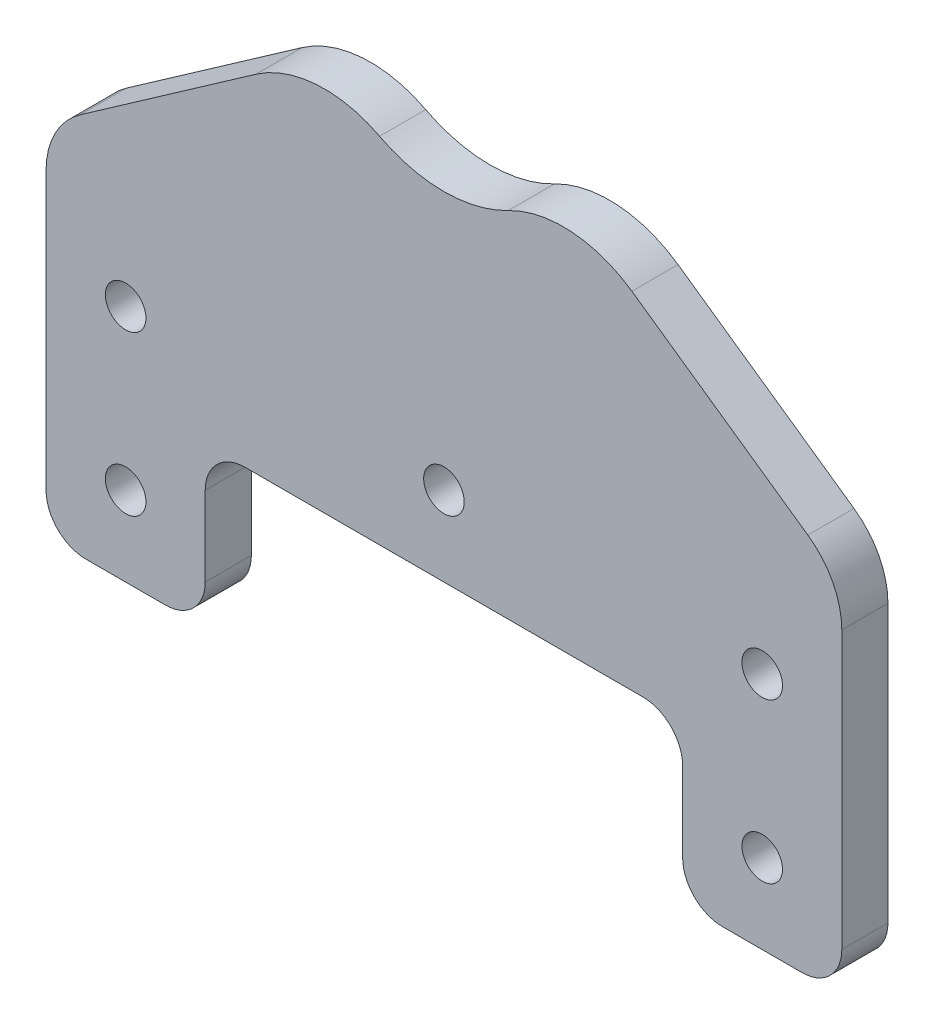
ISO-10303-21;
HEADER;
FILE_DESCRIPTION(('STEP AP214'),'2;1');
FILE_NAME('part.step','',(''),(''),'','','');
FILE_SCHEMA(('AUTOMOTIVE_DESIGN { 1 0 10303 214 1 1 1 1 }'));
ENDSEC;
DATA;
#1=APPLICATION_CONTEXT('core data for automotive mechanical design processes');
#2=APPLICATION_PROTOCOL_DEFINITION('international standard','automotive_design',2000,#1);
#3=PRODUCT_CONTEXT('',#1,'mechanical');
#4=PRODUCT('Part','Part','',(#3));
#5=PRODUCT_RELATED_PRODUCT_CATEGORY('part','',(#4));
#6=PRODUCT_DEFINITION_FORMATION('','',#4);
#7=PRODUCT_DEFINITION_CONTEXT('part definition',#1,'design');
#8=PRODUCT_DEFINITION('design','',#6,#7);
#9=PRODUCT_DEFINITION_SHAPE('','',#8);
#10=(LENGTH_UNIT() NAMED_UNIT(*) SI_UNIT(.MILLI.,.METRE.));
#11=(NAMED_UNIT(*) PLANE_ANGLE_UNIT() SI_UNIT($,.RADIAN.));
#12=(NAMED_UNIT(*) SI_UNIT($,.STERADIAN.) SOLID_ANGLE_UNIT());
#13=UNCERTAINTY_MEASURE_WITH_UNIT(LENGTH_MEASURE(1.E-05),#10,'distance_accuracy_value','');
#14=(GEOMETRIC_REPRESENTATION_CONTEXT(3) GLOBAL_UNCERTAINTY_ASSIGNED_CONTEXT((#13)) GLOBAL_UNIT_ASSIGNED_CONTEXT((#10,
#11,#12)) REPRESENTATION_CONTEXT('',''));
#15=CARTESIAN_POINT('',(0.,0.,0.));
#16=DIRECTION('',(0.,0.,1.));
#17=DIRECTION('',(1.,0.,0.));
#18=AXIS2_PLACEMENT_3D('',#15,#16,#17);
#19=CARTESIAN_POINT('',(0.,-30.,5.8));
#20=DIRECTION('',(0.,0.,-1.));
#21=DIRECTION('',(-1.,0.,0.));
#22=AXIS2_PLACEMENT_3D('',#19,#20,#21);
#23=PLANE('',#22);
#24=CARTESIAN_POINT('',(40.,-70.,5.8));
#25=DIRECTION('',(0.,0.,1.));
#26=DIRECTION('',(-1.,0.,0.));
#27=AXIS2_PLACEMENT_3D('',#24,#25,#26);
#28=CIRCLE('',#27,2.54999999999999);
#29=CARTESIAN_POINT('',(37.45,-70.,5.8));
#30=VERTEX_POINT('',#29);
#31=EDGE_CURVE('E276',#30,#30,#28,.T.);
#32=ORIENTED_EDGE('',*,*,#31,.F.);
#33=EDGE_LOOP('',(#32));
#34=FACE_BOUND('',#33,.T.);
#35=CARTESIAN_POINT('',(-40.,-70.,5.8));
#36=DIRECTION('',(0.,0.,1.));
#37=DIRECTION('',(1.,0.,0.));
#38=AXIS2_PLACEMENT_3D('',#35,#36,#37);
#39=CIRCLE('',#38,2.54999999999999);
#40=CARTESIAN_POINT('',(-37.45,-70.,5.8));
#41=VERTEX_POINT('',#40);
#42=EDGE_CURVE('E301',#41,#41,#39,.T.);
#43=ORIENTED_EDGE('',*,*,#42,.F.);
#44=EDGE_LOOP('',(#43));
#45=FACE_BOUND('',#44,.T.);
#46=CARTESIAN_POINT('',(40.,-50.,5.8));
#47=DIRECTION('',(0.,0.,1.));
#48=DIRECTION('',(1.,0.,0.));
#49=AXIS2_PLACEMENT_3D('',#46,#47,#48);
#50=CIRCLE('',#49,2.55);
#51=CARTESIAN_POINT('',(42.55,-50.,5.8));
#52=VERTEX_POINT('',#51);
#53=EDGE_CURVE('E307',#52,#52,#50,.T.);
#54=ORIENTED_EDGE('',*,*,#53,.F.);
#55=EDGE_LOOP('',(#54));
#56=FACE_BOUND('',#55,.T.);
#57=CARTESIAN_POINT('',(-40.,-50.,5.8));
#58=DIRECTION('',(0.,0.,1.));
#59=DIRECTION('',(1.,0.,0.));
#60=AXIS2_PLACEMENT_3D('',#57,#58,#59);
#61=CIRCLE('',#60,2.54999999999999);
#62=CARTESIAN_POINT('',(-37.45,-50.,5.8));
#63=VERTEX_POINT('',#62);
#64=EDGE_CURVE('E315',#63,#63,#61,.T.);
#65=ORIENTED_EDGE('',*,*,#64,.F.);
#66=EDGE_LOOP('',(#65));
#67=FACE_BOUND('',#66,.T.);
#68=CARTESIAN_POINT('',(0.,-50.,5.8));
#69=DIRECTION('',(0.,0.,1.));
#70=DIRECTION('',(1.,0.,0.));
#71=AXIS2_PLACEMENT_3D('',#68,#69,#70);
#72=CIRCLE('',#71,2.55);
#73=CARTESIAN_POINT('',(2.55000000000001,-50.,5.8));
#74=VERTEX_POINT('',#73);
#75=EDGE_CURVE('E214',#74,#74,#72,.T.);
#76=ORIENTED_EDGE('',*,*,#75,.F.);
#77=EDGE_LOOP('',(#76));
#78=FACE_BOUND('',#77,.T.);
#79=CARTESIAN_POINT('',(40.,-40.2065556157337,5.8));
#80=DIRECTION('',(0.,0.,-1.));
#81=DIRECTION('',(-1.,0.,0.));
#82=AXIS2_PLACEMENT_3D('',#79,#80,#81);
#83=CIRCLE('',#82,10.);
#84=CARTESIAN_POINT('',(45.7346234436333,-32.0142364105433,5.8));
#85=VERTEX_POINT('',#84);
#86=CARTESIAN_POINT('',(50.,-40.2065556157337,5.8));
#87=VERTEX_POINT('',#86);
#88=EDGE_CURVE('E49',#85,#87,#83,.T.);
#89=ORIENTED_EDGE('',*,*,#88,.F.);
#90=DIRECTION('',(0.81923192051904,-0.573462344363328,0.));
#91=VECTOR('',#90,1.);
#92=CARTESIAN_POINT('',(45.7346234436333,-32.0142364105433,5.8));
#93=LINE('',#92,#91);
#94=CARTESIAN_POINT('',(23.6196085073455,-16.5337259551418,5.8));
#95=VERTEX_POINT('',#94);
#96=EDGE_CURVE('E621',#95,#85,#93,.T.);
#97=ORIENTED_EDGE('',*,*,#96,.F.);
#98=CARTESIAN_POINT('',(15.0176733418956,-28.8222047629275,5.8));
#99=DIRECTION('',(0.,0.,-1.));
#100=DIRECTION('',(-1.,0.,0.));
#101=AXIS2_PLACEMENT_3D('',#98,#99,#100);
#102=CIRCLE('',#101,15.);
#103=CARTESIAN_POINT('',(8.08643949178993,-15.5196487184994,5.8));
#104=VERTEX_POINT('',#103);
#105=EDGE_CURVE('E623',#104,#95,#102,.T.);
#106=ORIENTED_EDGE('',*,*,#105,.F.);
#107=CARTESIAN_POINT('',(0.,0.,5.8));
#108=DIRECTION('',(0.,0.,1.));
#109=DIRECTION('',(-1.,0.,0.));
#110=AXIS2_PLACEMENT_3D('',#107,#108,#109);
#111=CIRCLE('',#110,17.5);
#112=CARTESIAN_POINT('',(-8.08643949178994,-15.5196487184994,5.8));
#113=VERTEX_POINT('',#112);
#114=EDGE_CURVE('E645',#113,#104,#111,.T.);
#115=ORIENTED_EDGE('',*,*,#114,.F.);
#116=CARTESIAN_POINT('',(-15.0176733418956,-28.8222047629275,5.8));
#117=DIRECTION('',(0.,0.,-1.));
#118=DIRECTION('',(1.,0.,0.));
#119=AXIS2_PLACEMENT_3D('',#116,#117,#118);
#120=CIRCLE('',#119,15.);
#121=CARTESIAN_POINT('',(-23.6196085073455,-16.5337259551419,5.8));
#122=VERTEX_POINT('',#121);
#123=EDGE_CURVE('E646',#122,#113,#120,.T.);
#124=ORIENTED_EDGE('',*,*,#123,.F.);
#125=DIRECTION('',(0.819231920519041,0.573462344363328,0.));
#126=VECTOR('',#125,1.);
#127=CARTESIAN_POINT('',(-23.6196085073455,-16.5337259551419,5.8));
#128=LINE('',#127,#126);
#129=CARTESIAN_POINT('',(-45.7346234436332,-32.0142364105432,5.8));
#130=VERTEX_POINT('',#129);
#131=EDGE_CURVE('E189',#130,#122,#128,.T.);
#132=ORIENTED_EDGE('',*,*,#131,.F.);
#133=CARTESIAN_POINT('',(-40.,-40.2065556157337,5.8));
#134=DIRECTION('',(0.,0.,-1.));
#135=DIRECTION('',(1.,0.,0.));
#136=AXIS2_PLACEMENT_3D('',#133,#134,#135);
#137=CIRCLE('',#136,10.);
#138=CARTESIAN_POINT('',(-50.,-40.2065556157337,5.8));
#139=VERTEX_POINT('',#138);
#140=EDGE_CURVE('E175',#139,#130,#137,.T.);
#141=ORIENTED_EDGE('',*,*,#140,.F.);
#142=DIRECTION('',(0.,-1.,0.));
#143=VECTOR('',#142,1.);
#144=CARTESIAN_POINT('',(-50.,-30.,5.8));
#145=LINE('',#144,#143);
#146=CARTESIAN_POINT('',(-50.,-75.,5.8));
#147=VERTEX_POINT('',#146);
#148=EDGE_CURVE('E185',#139,#147,#145,.T.);
#149=ORIENTED_EDGE('',*,*,#148,.T.);
#150=CARTESIAN_POINT('',(-45.,-75.,5.8));
#151=DIRECTION('',(0.,0.,-1.));
#152=DIRECTION('',(-1.,0.,0.));
#153=AXIS2_PLACEMENT_3D('',#150,#151,#152);
#154=CIRCLE('',#153,5.);
#155=CARTESIAN_POINT('',(-45.,-80.,5.8));
#156=VERTEX_POINT('',#155);
#157=EDGE_CURVE('E236',#147,#156,#154,.F.);
#158=ORIENTED_EDGE('',*,*,#157,.T.);
#159=DIRECTION('',(1.,0.,0.));
#160=VECTOR('',#159,1.);
#161=CARTESIAN_POINT('',(-50.,-80.,5.8));
#162=LINE('',#161,#160);
#163=CARTESIAN_POINT('',(-35.,-80.,5.8));
#164=VERTEX_POINT('',#163);
#165=EDGE_CURVE('E381',#156,#164,#162,.T.);
#166=ORIENTED_EDGE('',*,*,#165,.T.);
#167=CARTESIAN_POINT('',(-35.,-75.,5.8));
#168=DIRECTION('',(0.,0.,-1.));
#169=DIRECTION('',(-1.,0.,0.));
#170=AXIS2_PLACEMENT_3D('',#167,#168,#169);
#171=CIRCLE('',#170,5.);
#172=CARTESIAN_POINT('',(-30.,-75.,5.8));
#173=VERTEX_POINT('',#172);
#174=EDGE_CURVE('E238',#164,#173,#171,.F.);
#175=ORIENTED_EDGE('',*,*,#174,.T.);
#176=DIRECTION('',(0.,1.,0.));
#177=VECTOR('',#176,1.);
#178=CARTESIAN_POINT('',(-30.,-60.,5.8));
#179=LINE('',#178,#177);
#180=CARTESIAN_POINT('',(-30.,-65.,5.8));
#181=VERTEX_POINT('',#180);
#182=EDGE_CURVE('E383',#173,#181,#179,.T.);
#183=ORIENTED_EDGE('',*,*,#182,.T.);
#184=CARTESIAN_POINT('',(-25.,-65.,5.8));
#185=DIRECTION('',(0.,0.,-1.));
#186=DIRECTION('',(-1.,0.,0.));
#187=AXIS2_PLACEMENT_3D('',#184,#185,#186);
#188=CIRCLE('',#187,5.);
#189=CARTESIAN_POINT('',(-25.,-60.,5.8));
#190=VERTEX_POINT('',#189);
#191=EDGE_CURVE('E260',#181,#190,#188,.T.);
#192=ORIENTED_EDGE('',*,*,#191,.T.);
#193=DIRECTION('',(1.,0.,0.));
#194=VECTOR('',#193,1.);
#195=CARTESIAN_POINT('',(-50.,-60.,5.8));
#196=LINE('',#195,#194);
#197=CARTESIAN_POINT('',(25.,-60.,5.8));
#198=VERTEX_POINT('',#197);
#199=EDGE_CURVE('E196',#190,#198,#196,.T.);
#200=ORIENTED_EDGE('',*,*,#199,.T.);
#201=CARTESIAN_POINT('',(25.,-65.,5.8));
#202=DIRECTION('',(0.,0.,-1.));
#203=DIRECTION('',(-1.,0.,0.));
#204=AXIS2_PLACEMENT_3D('',#201,#202,#203);
#205=CIRCLE('',#204,5.);
#206=CARTESIAN_POINT('',(30.,-65.,5.8));
#207=VERTEX_POINT('',#206);
#208=EDGE_CURVE('E42',#198,#207,#205,.T.);
#209=ORIENTED_EDGE('',*,*,#208,.T.);
#210=DIRECTION('',(0.,-1.,0.));
#211=VECTOR('',#210,1.);
#212=CARTESIAN_POINT('',(30.,-60.,5.8));
#213=LINE('',#212,#211);
#214=CARTESIAN_POINT('',(30.,-75.,5.8));
#215=VERTEX_POINT('',#214);
#216=EDGE_CURVE('E265',#207,#215,#213,.T.);
#217=ORIENTED_EDGE('',*,*,#216,.T.);
#218=CARTESIAN_POINT('',(35.,-75.,5.8));
#219=DIRECTION('',(0.,0.,-1.));
#220=DIRECTION('',(-1.,0.,0.));
#221=AXIS2_PLACEMENT_3D('',#218,#219,#220);
#222=CIRCLE('',#221,5.);
#223=CARTESIAN_POINT('',(35.,-80.,5.8));
#224=VERTEX_POINT('',#223);
#225=EDGE_CURVE('E240',#215,#224,#222,.F.);
#226=ORIENTED_EDGE('',*,*,#225,.T.);
#227=DIRECTION('',(1.,0.,0.));
#228=VECTOR('',#227,1.);
#229=CARTESIAN_POINT('',(50.,-80.,5.8));
#230=LINE('',#229,#228);
#231=CARTESIAN_POINT('',(45.,-80.,5.8));
#232=VERTEX_POINT('',#231);
#233=EDGE_CURVE('E275',#224,#232,#230,.T.);
#234=ORIENTED_EDGE('',*,*,#233,.T.);
#235=CARTESIAN_POINT('',(45.,-75.,5.8));
#236=DIRECTION('',(0.,0.,-1.));
#237=DIRECTION('',(-1.,0.,0.));
#238=AXIS2_PLACEMENT_3D('',#235,#236,#237);
#239=CIRCLE('',#238,5.);
#240=CARTESIAN_POINT('',(50.,-75.,5.8));
#241=VERTEX_POINT('',#240);
#242=EDGE_CURVE('E242',#232,#241,#239,.F.);
#243=ORIENTED_EDGE('',*,*,#242,.T.);
#244=DIRECTION('',(0.,1.,0.));
#245=VECTOR('',#244,1.);
#246=CARTESIAN_POINT('',(50.,-30.,5.8));
#247=LINE('',#246,#245);
#248=EDGE_CURVE('E200',#241,#87,#247,.T.);
#249=ORIENTED_EDGE('',*,*,#248,.T.);
#250=EDGE_LOOP('',(#89,#97,#106,#115,#124,#132,#141,#149,#158,#166,#175,#183,#192,#200,#209,
#217,#226,#234,#243,#249));
#251=FACE_BOUND('',#250,.T.);
#252=ADVANCED_FACE('F34',(#34,#45,#56,#67,#78,#251),#23,.F.);
#253=CARTESIAN_POINT('',(0.,-30.,0.));
#254=DIRECTION('',(0.,0.,-1.));
#255=DIRECTION('',(-1.,0.,0.));
#256=AXIS2_PLACEMENT_3D('',#253,#254,#255);
#257=PLANE('',#256);
#258=CARTESIAN_POINT('',(40.,-70.,0.));
#259=DIRECTION('',(0.,0.,-1.));
#260=DIRECTION('',(-1.,0.,0.));
#261=AXIS2_PLACEMENT_3D('',#258,#259,#260);
#262=CIRCLE('',#261,2.54999999999999);
#263=CARTESIAN_POINT('',(37.45,-70.,0.));
#264=VERTEX_POINT('',#263);
#265=EDGE_CURVE('E299',#264,#264,#262,.F.);
#266=ORIENTED_EDGE('',*,*,#265,.T.);
#267=EDGE_LOOP('',(#266));
#268=FACE_BOUND('',#267,.T.);
#269=CARTESIAN_POINT('',(-40.,-70.,0.));
#270=DIRECTION('',(0.,0.,-1.));
#271=DIRECTION('',(-1.,0.,0.));
#272=AXIS2_PLACEMENT_3D('',#269,#270,#271);
#273=CIRCLE('',#272,2.54999999999999);
#274=CARTESIAN_POINT('',(-42.55,-70.,0.));
#275=VERTEX_POINT('',#274);
#276=EDGE_CURVE('E314',#275,#275,#273,.F.);
#277=ORIENTED_EDGE('',*,*,#276,.T.);
#278=EDGE_LOOP('',(#277));
#279=FACE_BOUND('',#278,.T.);
#280=CARTESIAN_POINT('',(40.,-50.,0.));
#281=DIRECTION('',(0.,0.,1.));
#282=DIRECTION('',(1.,0.,0.));
#283=AXIS2_PLACEMENT_3D('',#280,#281,#282);
#284=CIRCLE('',#283,2.55);
#285=CARTESIAN_POINT('',(42.55,-50.,0.));
#286=VERTEX_POINT('',#285);
#287=EDGE_CURVE('E311',#286,#286,#284,.T.);
#288=ORIENTED_EDGE('',*,*,#287,.T.);
#289=EDGE_LOOP('',(#288));
#290=FACE_BOUND('',#289,.T.);
#291=CARTESIAN_POINT('',(0.,-50.,0.));
#292=DIRECTION('',(0.,0.,1.));
#293=DIRECTION('',(1.,0.,0.));
#294=AXIS2_PLACEMENT_3D('',#291,#292,#293);
#295=CIRCLE('',#294,2.55);
#296=CARTESIAN_POINT('',(2.55000000000001,-50.,0.));
#297=VERTEX_POINT('',#296);
#298=EDGE_CURVE('E206',#297,#297,#295,.T.);
#299=ORIENTED_EDGE('',*,*,#298,.T.);
#300=EDGE_LOOP('',(#299));
#301=FACE_BOUND('',#300,.T.);
#302=CARTESIAN_POINT('',(-40.,-50.,0.));
#303=DIRECTION('',(0.,0.,1.));
#304=DIRECTION('',(1.,0.,0.));
#305=AXIS2_PLACEMENT_3D('',#302,#303,#304);
#306=CIRCLE('',#305,2.54999999999999);
#307=CARTESIAN_POINT('',(-37.45,-50.,0.));
#308=VERTEX_POINT('',#307);
#309=EDGE_CURVE('E310',#308,#308,#306,.T.);
#310=ORIENTED_EDGE('',*,*,#309,.T.);
#311=EDGE_LOOP('',(#310));
#312=FACE_BOUND('',#311,.T.);
#313=DIRECTION('',(0.81923192051904,-0.573462344363328,0.));
#314=VECTOR('',#313,1.);
#315=CARTESIAN_POINT('',(45.7346234436333,-32.0142364105433,0.));
#316=LINE('',#315,#314);
#317=CARTESIAN_POINT('',(23.6196085073455,-16.5337259551418,0.));
#318=VERTEX_POINT('',#317);
#319=CARTESIAN_POINT('',(45.7346234436333,-32.0142364105433,0.));
#320=VERTEX_POINT('',#319);
#321=EDGE_CURVE('E639',#318,#320,#316,.T.);
#322=ORIENTED_EDGE('',*,*,#321,.T.);
#323=CARTESIAN_POINT('',(40.,-40.2065556157337,0.));
#324=DIRECTION('',(0.,0.,-1.));
#325=DIRECTION('',(-1.,0.,0.));
#326=AXIS2_PLACEMENT_3D('',#323,#324,#325);
#327=CIRCLE('',#326,10.);
#328=CARTESIAN_POINT('',(50.,-40.2065556157337,0.));
#329=VERTEX_POINT('',#328);
#330=EDGE_CURVE('E190',#320,#329,#327,.T.);
#331=ORIENTED_EDGE('',*,*,#330,.T.);
#332=DIRECTION('',(0.,1.,0.));
#333=VECTOR('',#332,1.);
#334=CARTESIAN_POINT('',(50.,-30.,0.));
#335=LINE('',#334,#333);
#336=CARTESIAN_POINT('',(50.,-75.,0.));
#337=VERTEX_POINT('',#336);
#338=EDGE_CURVE('E197',#337,#329,#335,.T.);
#339=ORIENTED_EDGE('',*,*,#338,.F.);
#340=CARTESIAN_POINT('',(45.,-75.,0.));
#341=DIRECTION('',(0.,0.,-1.));
#342=DIRECTION('',(-1.,0.,0.));
#343=AXIS2_PLACEMENT_3D('',#340,#341,#342);
#344=CIRCLE('',#343,5.);
#345=CARTESIAN_POINT('',(45.,-80.,0.));
#346=VERTEX_POINT('',#345);
#347=EDGE_CURVE('E252',#337,#346,#344,.T.);
#348=ORIENTED_EDGE('',*,*,#347,.T.);
#349=DIRECTION('',(1.,0.,0.));
#350=VECTOR('',#349,1.);
#351=CARTESIAN_POINT('',(50.,-80.,0.));
#352=LINE('',#351,#350);
#353=CARTESIAN_POINT('',(35.,-80.,0.));
#354=VERTEX_POINT('',#353);
#355=EDGE_CURVE('E587',#354,#346,#352,.T.);
#356=ORIENTED_EDGE('',*,*,#355,.F.);
#357=CARTESIAN_POINT('',(35.,-75.,0.));
#358=DIRECTION('',(0.,0.,-1.));
#359=DIRECTION('',(-1.,0.,0.));
#360=AXIS2_PLACEMENT_3D('',#357,#358,#359);
#361=CIRCLE('',#360,5.);
#362=CARTESIAN_POINT('',(30.,-75.,0.));
#363=VERTEX_POINT('',#362);
#364=EDGE_CURVE('E250',#354,#363,#361,.T.);
#365=ORIENTED_EDGE('',*,*,#364,.T.);
#366=DIRECTION('',(0.,-1.,0.));
#367=VECTOR('',#366,1.);
#368=CARTESIAN_POINT('',(30.,-60.,0.));
#369=LINE('',#368,#367);
#370=CARTESIAN_POINT('',(30.,-65.,0.));
#371=VERTEX_POINT('',#370);
#372=EDGE_CURVE('E284',#371,#363,#369,.T.);
#373=ORIENTED_EDGE('',*,*,#372,.F.);
#374=CARTESIAN_POINT('',(25.,-65.,0.));
#375=DIRECTION('',(0.,0.,-1.));
#376=DIRECTION('',(-1.,0.,0.));
#377=AXIS2_PLACEMENT_3D('',#374,#375,#376);
#378=CIRCLE('',#377,5.);
#379=CARTESIAN_POINT('',(25.,-60.,0.));
#380=VERTEX_POINT('',#379);
#381=EDGE_CURVE('E12',#371,#380,#378,.F.);
#382=ORIENTED_EDGE('',*,*,#381,.T.);
#383=DIRECTION('',(1.,0.,0.));
#384=VECTOR('',#383,1.);
#385=CARTESIAN_POINT('',(-50.,-60.,0.));
#386=LINE('',#385,#384);
#387=CARTESIAN_POINT('',(-25.,-60.,0.));
#388=VERTEX_POINT('',#387);
#389=EDGE_CURVE('E203',#388,#380,#386,.T.);
#390=ORIENTED_EDGE('',*,*,#389,.F.);
#391=CARTESIAN_POINT('',(-25.,-65.,0.));
#392=DIRECTION('',(0.,0.,-1.));
#393=DIRECTION('',(-1.,0.,0.));
#394=AXIS2_PLACEMENT_3D('',#391,#392,#393);
#395=CIRCLE('',#394,5.);
#396=CARTESIAN_POINT('',(-30.,-65.,0.));
#397=VERTEX_POINT('',#396);
#398=EDGE_CURVE('E262',#388,#397,#395,.F.);
#399=ORIENTED_EDGE('',*,*,#398,.T.);
#400=DIRECTION('',(0.,1.,0.));
#401=VECTOR('',#400,1.);
#402=CARTESIAN_POINT('',(-30.,-60.,0.));
#403=LINE('',#402,#401);
#404=CARTESIAN_POINT('',(-30.,-75.,0.));
#405=VERTEX_POINT('',#404);
#406=EDGE_CURVE('E292',#405,#397,#403,.T.);
#407=ORIENTED_EDGE('',*,*,#406,.F.);
#408=CARTESIAN_POINT('',(-35.,-75.,0.));
#409=DIRECTION('',(0.,0.,-1.));
#410=DIRECTION('',(-1.,0.,0.));
#411=AXIS2_PLACEMENT_3D('',#408,#409,#410);
#412=CIRCLE('',#411,5.);
#413=CARTESIAN_POINT('',(-35.,-80.,0.));
#414=VERTEX_POINT('',#413);
#415=EDGE_CURVE('E57',#405,#414,#412,.T.);
#416=ORIENTED_EDGE('',*,*,#415,.T.);
#417=DIRECTION('',(1.,0.,0.));
#418=VECTOR('',#417,1.);
#419=CARTESIAN_POINT('',(-50.,-80.,0.));
#420=LINE('',#419,#418);
#421=CARTESIAN_POINT('',(-45.,-80.,0.));
#422=VERTEX_POINT('',#421);
#423=EDGE_CURVE('E298',#422,#414,#420,.T.);
#424=ORIENTED_EDGE('',*,*,#423,.F.);
#425=CARTESIAN_POINT('',(-45.,-75.,0.));
#426=DIRECTION('',(0.,0.,-1.));
#427=DIRECTION('',(-1.,0.,0.));
#428=AXIS2_PLACEMENT_3D('',#425,#426,#427);
#429=CIRCLE('',#428,5.);
#430=CARTESIAN_POINT('',(-50.,-75.,0.));
#431=VERTEX_POINT('',#430);
#432=EDGE_CURVE('E246',#422,#431,#429,.T.);
#433=ORIENTED_EDGE('',*,*,#432,.T.);
#434=DIRECTION('',(0.,-1.,0.));
#435=VECTOR('',#434,1.);
#436=CARTESIAN_POINT('',(-50.,-30.,0.));
#437=LINE('',#436,#435);
#438=CARTESIAN_POINT('',(-50.,-40.2065556157337,0.));
#439=VERTEX_POINT('',#438);
#440=EDGE_CURVE('E212',#439,#431,#437,.T.);
#441=ORIENTED_EDGE('',*,*,#440,.F.);
#442=CARTESIAN_POINT('',(-40.,-40.2065556157337,0.));
#443=DIRECTION('',(0.,0.,-1.));
#444=DIRECTION('',(1.,0.,0.));
#445=AXIS2_PLACEMENT_3D('',#442,#443,#444);
#446=CIRCLE('',#445,10.);
#447=CARTESIAN_POINT('',(-45.7346234436332,-32.0142364105432,0.));
#448=VERTEX_POINT('',#447);
#449=EDGE_CURVE('E178',#439,#448,#446,.T.);
#450=ORIENTED_EDGE('',*,*,#449,.T.);
#451=DIRECTION('',(0.819231920519041,0.573462344363328,0.));
#452=VECTOR('',#451,1.);
#453=CARTESIAN_POINT('',(-23.6196085073455,-16.5337259551419,0.));
#454=LINE('',#453,#452);
#455=CARTESIAN_POINT('',(-23.6196085073455,-16.5337259551419,0.));
#456=VERTEX_POINT('',#455);
#457=EDGE_CURVE('E628',#448,#456,#454,.T.);
#458=ORIENTED_EDGE('',*,*,#457,.T.);
#459=CARTESIAN_POINT('',(-15.0176733418956,-28.8222047629275,0.));
#460=DIRECTION('',(0.,0.,-1.));
#461=DIRECTION('',(1.,0.,0.));
#462=AXIS2_PLACEMENT_3D('',#459,#460,#461);
#463=CIRCLE('',#462,15.);
#464=CARTESIAN_POINT('',(-8.08643949178994,-15.5196487184994,0.));
#465=VERTEX_POINT('',#464);
#466=EDGE_CURVE('E631',#456,#465,#463,.T.);
#467=ORIENTED_EDGE('',*,*,#466,.T.);
#468=CARTESIAN_POINT('',(0.,0.,0.));
#469=DIRECTION('',(0.,0.,1.));
#470=DIRECTION('',(-1.,0.,0.));
#471=AXIS2_PLACEMENT_3D('',#468,#469,#470);
#472=CIRCLE('',#471,17.5);
#473=CARTESIAN_POINT('',(8.08643949178993,-15.5196487184994,0.));
#474=VERTEX_POINT('',#473);
#475=EDGE_CURVE('E634',#465,#474,#472,.T.);
#476=ORIENTED_EDGE('',*,*,#475,.T.);
#477=CARTESIAN_POINT('',(15.0176733418956,-28.8222047629275,0.));
#478=DIRECTION('',(0.,0.,-1.));
#479=DIRECTION('',(-1.,0.,0.));
#480=AXIS2_PLACEMENT_3D('',#477,#478,#479);
#481=CIRCLE('',#480,15.);
#482=EDGE_CURVE('E637',#474,#318,#481,.T.);
#483=ORIENTED_EDGE('',*,*,#482,.T.);
#484=EDGE_LOOP('',(#322,#331,#339,#348,#356,#365,#373,#382,#390,#399,#407,#416,#424,#433,#441,
#450,#458,#467,#476,#483));
#485=FACE_BOUND('',#484,.T.);
#486=ADVANCED_FACE('F282',(#268,#279,#290,#301,#312,#485),#257,.T.);
#487=CARTESIAN_POINT('',(50.,-30.,5.8));
#488=DIRECTION('',(-1.,0.,0.));
#489=DIRECTION('',(0.,-1.,0.));
#490=AXIS2_PLACEMENT_3D('',#487,#488,#489);
#491=PLANE('',#490);
#492=DIRECTION('',(0.,0.,-1.));
#493=VECTOR('',#492,1.);
#494=CARTESIAN_POINT('',(50.,-40.2065556157337,5.8));
#495=LINE('',#494,#493);
#496=EDGE_CURVE('E591',#87,#329,#495,.T.);
#497=ORIENTED_EDGE('',*,*,#496,.F.);
#498=ORIENTED_EDGE('',*,*,#248,.F.);
#499=DIRECTION('',(0.,0.,1.));
#500=VECTOR('',#499,1.);
#501=CARTESIAN_POINT('',(50.,-75.,0.));
#502=LINE('',#501,#500);
#503=EDGE_CURVE('E244',#241,#337,#502,.F.);
#504=ORIENTED_EDGE('',*,*,#503,.T.);
#505=ORIENTED_EDGE('',*,*,#338,.T.);
#506=EDGE_LOOP('',(#497,#498,#504,#505));
#507=FACE_BOUND('',#506,.T.);
#508=ADVANCED_FACE('F345',(#507),#491,.F.);
#509=CARTESIAN_POINT('',(-50.,-60.,5.8));
#510=DIRECTION('',(0.,1.,0.));
#511=DIRECTION('',(0.,0.,1.));
#512=AXIS2_PLACEMENT_3D('',#509,#510,#511);
#513=PLANE('',#512);
#514=ORIENTED_EDGE('',*,*,#199,.F.);
#515=DIRECTION('',(0.,0.,1.));
#516=VECTOR('',#515,1.);
#517=CARTESIAN_POINT('',(-25.,-60.,5.8));
#518=LINE('',#517,#516);
#519=EDGE_CURVE('E224',#190,#388,#518,.F.);
#520=ORIENTED_EDGE('',*,*,#519,.T.);
#521=ORIENTED_EDGE('',*,*,#389,.T.);
#522=DIRECTION('',(0.,0.,1.));
#523=VECTOR('',#522,1.);
#524=CARTESIAN_POINT('',(25.,-60.,5.8));
#525=LINE('',#524,#523);
#526=EDGE_CURVE('E221',#380,#198,#525,.T.);
#527=ORIENTED_EDGE('',*,*,#526,.T.);
#528=EDGE_LOOP('',(#514,#520,#521,#527));
#529=FACE_BOUND('',#528,.T.);
#530=ADVANCED_FACE('F286',(#529),#513,.F.);
#531=CARTESIAN_POINT('',(-50.,-30.,5.8));
#532=DIRECTION('',(1.,0.,0.));
#533=DIRECTION('',(0.,0.,-1.));
#534=AXIS2_PLACEMENT_3D('',#531,#532,#533);
#535=PLANE('',#534);
#536=ORIENTED_EDGE('',*,*,#148,.F.);
#537=DIRECTION('',(0.,0.,-1.));
#538=VECTOR('',#537,1.);
#539=CARTESIAN_POINT('',(-50.,-40.2065556157337,5.8));
#540=LINE('',#539,#538);
#541=EDGE_CURVE('E172',#139,#439,#540,.T.);
#542=ORIENTED_EDGE('',*,*,#541,.T.);
#543=ORIENTED_EDGE('',*,*,#440,.T.);
#544=DIRECTION('',(0.,0.,1.));
#545=VECTOR('',#544,1.);
#546=CARTESIAN_POINT('',(-50.,-75.,5.8));
#547=LINE('',#546,#545);
#548=EDGE_CURVE('E195',#431,#147,#547,.T.);
#549=ORIENTED_EDGE('',*,*,#548,.T.);
#550=EDGE_LOOP('',(#536,#542,#543,#549));
#551=FACE_BOUND('',#550,.T.);
#552=ADVANCED_FACE('F193',(#551),#535,.F.);
#553=CARTESIAN_POINT('',(0.,-50.,5.8));
#554=DIRECTION('',(0.,0.,-1.));
#555=DIRECTION('',(-1.,0.,0.));
#556=AXIS2_PLACEMENT_3D('',#553,#554,#555);
#557=CYLINDRICAL_SURFACE('',#556,2.55);
#558=ORIENTED_EDGE('',*,*,#75,.T.);
#559=EDGE_LOOP('',(#558));
#560=FACE_BOUND('',#559,.T.);
#561=ORIENTED_EDGE('',*,*,#298,.F.);
#562=EDGE_LOOP('',(#561));
#563=FACE_BOUND('',#562,.T.);
#564=ADVANCED_FACE('F327',(#560,#563),#557,.F.);
#565=CARTESIAN_POINT('',(-40.,-50.,5.8));
#566=DIRECTION('',(0.,0.,-1.));
#567=DIRECTION('',(-1.,0.,0.));
#568=AXIS2_PLACEMENT_3D('',#565,#566,#567);
#569=CYLINDRICAL_SURFACE('',#568,2.54999999999999);
#570=ORIENTED_EDGE('',*,*,#64,.T.);
#571=EDGE_LOOP('',(#570));
#572=FACE_BOUND('',#571,.T.);
#573=ORIENTED_EDGE('',*,*,#309,.F.);
#574=EDGE_LOOP('',(#573));
#575=FACE_BOUND('',#574,.T.);
#576=ADVANCED_FACE('F329',(#572,#575),#569,.F.);
#577=CARTESIAN_POINT('',(40.,-50.,5.8));
#578=DIRECTION('',(0.,0.,-1.));
#579=DIRECTION('',(-1.,0.,0.));
#580=AXIS2_PLACEMENT_3D('',#577,#578,#579);
#581=CYLINDRICAL_SURFACE('',#580,2.55);
#582=ORIENTED_EDGE('',*,*,#53,.T.);
#583=EDGE_LOOP('',(#582));
#584=FACE_BOUND('',#583,.T.);
#585=ORIENTED_EDGE('',*,*,#287,.F.);
#586=EDGE_LOOP('',(#585));
#587=FACE_BOUND('',#586,.T.);
#588=ADVANCED_FACE('F335',(#584,#587),#581,.F.);
#589=CARTESIAN_POINT('',(-30.,-60.,-28.2842712474619));
#590=DIRECTION('',(1.,0.,0.));
#591=DIRECTION('',(0.,1.,0.));
#592=AXIS2_PLACEMENT_3D('',#589,#590,#591);
#593=PLANE('',#592);
#594=ORIENTED_EDGE('',*,*,#406,.T.);
#595=DIRECTION('',(0.,0.,1.));
#596=VECTOR('',#595,1.);
#597=CARTESIAN_POINT('',(-30.,-65.,-28.2842712474619));
#598=LINE('',#597,#596);
#599=EDGE_CURVE('E218',#397,#181,#598,.T.);
#600=ORIENTED_EDGE('',*,*,#599,.T.);
#601=ORIENTED_EDGE('',*,*,#182,.F.);
#602=DIRECTION('',(0.,0.,1.));
#603=VECTOR('',#602,1.);
#604=CARTESIAN_POINT('',(-30.,-75.,-28.2842712474619));
#605=LINE('',#604,#603);
#606=EDGE_CURVE('E211',#173,#405,#605,.F.);
#607=ORIENTED_EDGE('',*,*,#606,.T.);
#608=EDGE_LOOP('',(#594,#600,#601,#607));
#609=FACE_BOUND('',#608,.T.);
#610=ADVANCED_FACE('F294',(#609),#593,.T.);
#611=CARTESIAN_POINT('',(-50.,-80.,-28.2842712474619));
#612=DIRECTION('',(0.,-1.,0.));
#613=DIRECTION('',(0.,0.,-1.));
#614=AXIS2_PLACEMENT_3D('',#611,#612,#613);
#615=PLANE('',#614);
#616=ORIENTED_EDGE('',*,*,#423,.T.);
#617=DIRECTION('',(0.,0.,1.));
#618=VECTOR('',#617,1.);
#619=CARTESIAN_POINT('',(-35.,-80.,-28.2842712474619));
#620=LINE('',#619,#618);
#621=EDGE_CURVE('E256',#414,#164,#620,.T.);
#622=ORIENTED_EDGE('',*,*,#621,.T.);
#623=ORIENTED_EDGE('',*,*,#165,.F.);
#624=DIRECTION('',(0.,0.,1.));
#625=VECTOR('',#624,1.);
#626=CARTESIAN_POINT('',(-45.,-80.,0.));
#627=LINE('',#626,#625);
#628=EDGE_CURVE('E254',#156,#422,#627,.F.);
#629=ORIENTED_EDGE('',*,*,#628,.T.);
#630=EDGE_LOOP('',(#616,#622,#623,#629));
#631=FACE_BOUND('',#630,.T.);
#632=ADVANCED_FACE('F380',(#631),#615,.T.);
#633=CARTESIAN_POINT('',(-40.,-70.,-28.2842712474619));
#634=DIRECTION('',(0.,0.,1.));
#635=DIRECTION('',(1.,0.,0.));
#636=AXIS2_PLACEMENT_3D('',#633,#634,#635);
#637=CYLINDRICAL_SURFACE('',#636,2.54999999999999);
#638=ORIENTED_EDGE('',*,*,#42,.T.);
#639=EDGE_LOOP('',(#638));
#640=FACE_BOUND('',#639,.T.);
#641=ORIENTED_EDGE('',*,*,#276,.F.);
#642=EDGE_LOOP('',(#641));
#643=FACE_BOUND('',#642,.T.);
#644=ADVANCED_FACE('F394',(#640,#643),#637,.F.);
#645=CARTESIAN_POINT('',(50.,-80.,-28.2842712474619));
#646=DIRECTION('',(0.,-1.,0.));
#647=DIRECTION('',(0.,0.,-1.));
#648=AXIS2_PLACEMENT_3D('',#645,#646,#647);
#649=PLANE('',#648);
#650=ORIENTED_EDGE('',*,*,#355,.T.);
#651=DIRECTION('',(0.,0.,1.));
#652=VECTOR('',#651,1.);
#653=CARTESIAN_POINT('',(45.,-80.,5.8));
#654=LINE('',#653,#652);
#655=EDGE_CURVE('E233',#346,#232,#654,.T.);
#656=ORIENTED_EDGE('',*,*,#655,.T.);
#657=ORIENTED_EDGE('',*,*,#233,.F.);
#658=DIRECTION('',(0.,0.,1.));
#659=VECTOR('',#658,1.);
#660=CARTESIAN_POINT('',(35.,-80.,-28.2842712474619));
#661=LINE('',#660,#659);
#662=EDGE_CURVE('E231',#224,#354,#661,.F.);
#663=ORIENTED_EDGE('',*,*,#662,.T.);
#664=EDGE_LOOP('',(#650,#656,#657,#663));
#665=FACE_BOUND('',#664,.T.);
#666=ADVANCED_FACE('F396',(#665),#649,.T.);
#667=CARTESIAN_POINT('',(30.,-60.,-28.2842712474619));
#668=DIRECTION('',(-1.,0.,0.));
#669=DIRECTION('',(0.,-1.,0.));
#670=AXIS2_PLACEMENT_3D('',#667,#668,#669);
#671=PLANE('',#670);
#672=ORIENTED_EDGE('',*,*,#216,.F.);
#673=DIRECTION('',(0.,0.,1.));
#674=VECTOR('',#673,1.);
#675=CARTESIAN_POINT('',(30.,-65.,-28.2842712474619));
#676=LINE('',#675,#674);
#677=EDGE_CURVE('E229',#207,#371,#676,.F.);
#678=ORIENTED_EDGE('',*,*,#677,.T.);
#679=ORIENTED_EDGE('',*,*,#372,.T.);
#680=DIRECTION('',(0.,0.,1.));
#681=VECTOR('',#680,1.);
#682=CARTESIAN_POINT('',(30.,-75.,-28.2842712474619));
#683=LINE('',#682,#681);
#684=EDGE_CURVE('E226',#363,#215,#683,.T.);
#685=ORIENTED_EDGE('',*,*,#684,.T.);
#686=EDGE_LOOP('',(#672,#678,#679,#685));
#687=FACE_BOUND('',#686,.T.);
#688=ADVANCED_FACE('F271',(#687),#671,.T.);
#689=CARTESIAN_POINT('',(40.,-70.,-28.2842712474619));
#690=DIRECTION('',(0.,0.,1.));
#691=DIRECTION('',(1.,0.,0.));
#692=AXIS2_PLACEMENT_3D('',#689,#690,#691);
#693=CYLINDRICAL_SURFACE('',#692,2.54999999999999);
#694=ORIENTED_EDGE('',*,*,#31,.T.);
#695=EDGE_LOOP('',(#694));
#696=FACE_BOUND('',#695,.T.);
#697=ORIENTED_EDGE('',*,*,#265,.F.);
#698=EDGE_LOOP('',(#697));
#699=FACE_BOUND('',#698,.T.);
#700=ADVANCED_FACE('F358',(#696,#699),#693,.F.);
#701=CARTESIAN_POINT('',(-25.,-65.,-28.2842712474619));
#702=DIRECTION('',(0.,0.,1.));
#703=DIRECTION('',(1.,0.,0.));
#704=AXIS2_PLACEMENT_3D('',#701,#702,#703);
#705=CYLINDRICAL_SURFACE('',#704,5.);
#706=ORIENTED_EDGE('',*,*,#398,.F.);
#707=ORIENTED_EDGE('',*,*,#519,.F.);
#708=ORIENTED_EDGE('',*,*,#191,.F.);
#709=ORIENTED_EDGE('',*,*,#599,.F.);
#710=EDGE_LOOP('',(#706,#707,#708,#709));
#711=FACE_BOUND('',#710,.T.);
#712=ADVANCED_FACE('F289',(#711),#705,.F.);
#713=CARTESIAN_POINT('',(25.,-65.,5.8));
#714=DIRECTION('',(0.,0.,1.));
#715=DIRECTION('',(1.,0.,0.));
#716=AXIS2_PLACEMENT_3D('',#713,#714,#715);
#717=CYLINDRICAL_SURFACE('',#716,5.);
#718=ORIENTED_EDGE('',*,*,#381,.F.);
#719=ORIENTED_EDGE('',*,*,#677,.F.);
#720=ORIENTED_EDGE('',*,*,#208,.F.);
#721=ORIENTED_EDGE('',*,*,#526,.F.);
#722=EDGE_LOOP('',(#718,#719,#720,#721));
#723=FACE_BOUND('',#722,.T.);
#724=ADVANCED_FACE('F279',(#723),#717,.F.);
#725=CARTESIAN_POINT('',(45.,-75.,-28.2842712474619));
#726=DIRECTION('',(0.,0.,-1.));
#727=DIRECTION('',(-1.,0.,0.));
#728=AXIS2_PLACEMENT_3D('',#725,#726,#727);
#729=CYLINDRICAL_SURFACE('',#728,5.);
#730=ORIENTED_EDGE('',*,*,#347,.F.);
#731=ORIENTED_EDGE('',*,*,#503,.F.);
#732=ORIENTED_EDGE('',*,*,#242,.F.);
#733=ORIENTED_EDGE('',*,*,#655,.F.);
#734=EDGE_LOOP('',(#730,#731,#732,#733));
#735=FACE_BOUND('',#734,.T.);
#736=ADVANCED_FACE('F361',(#735),#729,.T.);
#737=CARTESIAN_POINT('',(35.,-75.,-28.2842712474619));
#738=DIRECTION('',(0.,0.,1.));
#739=DIRECTION('',(1.,0.,0.));
#740=AXIS2_PLACEMENT_3D('',#737,#738,#739);
#741=CYLINDRICAL_SURFACE('',#740,5.);
#742=ORIENTED_EDGE('',*,*,#364,.F.);
#743=ORIENTED_EDGE('',*,*,#662,.F.);
#744=ORIENTED_EDGE('',*,*,#225,.F.);
#745=ORIENTED_EDGE('',*,*,#684,.F.);
#746=EDGE_LOOP('',(#742,#743,#744,#745));
#747=FACE_BOUND('',#746,.T.);
#748=ADVANCED_FACE('F364',(#747),#741,.T.);
#749=CARTESIAN_POINT('',(-35.,-75.,-28.2842712474619));
#750=DIRECTION('',(0.,0.,1.));
#751=DIRECTION('',(1.,0.,0.));
#752=AXIS2_PLACEMENT_3D('',#749,#750,#751);
#753=CYLINDRICAL_SURFACE('',#752,5.);
#754=ORIENTED_EDGE('',*,*,#415,.F.);
#755=ORIENTED_EDGE('',*,*,#606,.F.);
#756=ORIENTED_EDGE('',*,*,#174,.F.);
#757=ORIENTED_EDGE('',*,*,#621,.F.);
#758=EDGE_LOOP('',(#754,#755,#756,#757));
#759=FACE_BOUND('',#758,.T.);
#760=ADVANCED_FACE('F367',(#759),#753,.T.);
#761=CARTESIAN_POINT('',(-45.,-75.,5.8));
#762=DIRECTION('',(0.,0.,-1.));
#763=DIRECTION('',(-1.,0.,0.));
#764=AXIS2_PLACEMENT_3D('',#761,#762,#763);
#765=CYLINDRICAL_SURFACE('',#764,5.);
#766=ORIENTED_EDGE('',*,*,#432,.F.);
#767=ORIENTED_EDGE('',*,*,#628,.F.);
#768=ORIENTED_EDGE('',*,*,#157,.F.);
#769=ORIENTED_EDGE('',*,*,#548,.F.);
#770=EDGE_LOOP('',(#766,#767,#768,#769));
#771=FACE_BOUND('',#770,.T.);
#772=ADVANCED_FACE('F36',(#771),#765,.T.);
#773=CARTESIAN_POINT('',(40.,-40.2065556157337,5.8));
#774=DIRECTION('',(0.,0.,-1.));
#775=DIRECTION('',(-1.,0.,0.));
#776=AXIS2_PLACEMENT_3D('',#773,#774,#775);
#777=CYLINDRICAL_SURFACE('',#776,10.);
#778=ORIENTED_EDGE('',*,*,#330,.F.);
#779=DIRECTION('',(0.,0.,-1.));
#780=VECTOR('',#779,1.);
#781=CARTESIAN_POINT('',(45.7346234436333,-32.0142364105433,5.8));
#782=LINE('',#781,#780);
#783=EDGE_CURVE('E594',#85,#320,#782,.T.);
#784=ORIENTED_EDGE('',*,*,#783,.F.);
#785=ORIENTED_EDGE('',*,*,#88,.T.);
#786=ORIENTED_EDGE('',*,*,#496,.T.);
#787=EDGE_LOOP('',(#778,#784,#785,#786));
#788=FACE_BOUND('',#787,.T.);
#789=ADVANCED_FACE('F374',(#788),#777,.T.);
#790=CARTESIAN_POINT('',(45.7346234436333,-32.0142364105433,5.8));
#791=DIRECTION('',(0.573462344363328,0.81923192051904,0.));
#792=DIRECTION('',(-0.819231920519041,0.573462344363328,0.));
#793=AXIS2_PLACEMENT_3D('',#790,#791,#792);
#794=PLANE('',#793);
#795=ORIENTED_EDGE('',*,*,#321,.F.);
#796=DIRECTION('',(0.,0.,-1.));
#797=VECTOR('',#796,1.);
#798=CARTESIAN_POINT('',(23.6196085073455,-16.5337259551418,5.8));
#799=LINE('',#798,#797);
#800=EDGE_CURVE('E598',#95,#318,#799,.T.);
#801=ORIENTED_EDGE('',*,*,#800,.F.);
#802=ORIENTED_EDGE('',*,*,#96,.T.);
#803=ORIENTED_EDGE('',*,*,#783,.T.);
#804=EDGE_LOOP('',(#795,#801,#802,#803));
#805=FACE_BOUND('',#804,.T.);
#806=ADVANCED_FACE('F518',(#805),#794,.T.);
#807=CARTESIAN_POINT('',(15.0176733418956,-28.8222047629275,5.8));
#808=DIRECTION('',(0.,0.,-1.));
#809=DIRECTION('',(-1.,0.,0.));
#810=AXIS2_PLACEMENT_3D('',#807,#808,#809);
#811=CYLINDRICAL_SURFACE('',#810,15.);
#812=ORIENTED_EDGE('',*,*,#482,.F.);
#813=DIRECTION('',(0.,0.,-1.));
#814=VECTOR('',#813,1.);
#815=CARTESIAN_POINT('',(8.08643949178993,-15.5196487184994,5.8));
#816=LINE('',#815,#814);
#817=EDGE_CURVE('E604',#104,#474,#816,.T.);
#818=ORIENTED_EDGE('',*,*,#817,.F.);
#819=ORIENTED_EDGE('',*,*,#105,.T.);
#820=ORIENTED_EDGE('',*,*,#800,.T.);
#821=EDGE_LOOP('',(#812,#818,#819,#820));
#822=FACE_BOUND('',#821,.T.);
#823=ADVANCED_FACE('F527',(#822),#811,.T.);
#824=CARTESIAN_POINT('',(0.,0.,5.8));
#825=DIRECTION('',(0.,0.,-1.));
#826=DIRECTION('',(-1.,0.,0.));
#827=AXIS2_PLACEMENT_3D('',#824,#825,#826);
#828=CYLINDRICAL_SURFACE('',#827,17.5);
#829=ORIENTED_EDGE('',*,*,#475,.F.);
#830=DIRECTION('',(0.,0.,-1.));
#831=VECTOR('',#830,1.);
#832=CARTESIAN_POINT('',(-8.08643949178994,-15.5196487184994,5.8));
#833=LINE('',#832,#831);
#834=EDGE_CURVE('E606',#113,#465,#833,.T.);
#835=ORIENTED_EDGE('',*,*,#834,.F.);
#836=ORIENTED_EDGE('',*,*,#114,.T.);
#837=ORIENTED_EDGE('',*,*,#817,.T.);
#838=EDGE_LOOP('',(#829,#835,#836,#837));
#839=FACE_BOUND('',#838,.T.);
#840=ADVANCED_FACE('F537',(#839),#828,.F.);
#841=CARTESIAN_POINT('',(-15.0176733418956,-28.8222047629275,5.8));
#842=DIRECTION('',(0.,0.,-1.));
#843=DIRECTION('',(-1.,0.,0.));
#844=AXIS2_PLACEMENT_3D('',#841,#842,#843);
#845=CYLINDRICAL_SURFACE('',#844,15.);
#846=ORIENTED_EDGE('',*,*,#466,.F.);
#847=DIRECTION('',(0.,0.,-1.));
#848=VECTOR('',#847,1.);
#849=CARTESIAN_POINT('',(-23.6196085073455,-16.5337259551419,5.8));
#850=LINE('',#849,#848);
#851=EDGE_CURVE('E608',#122,#456,#850,.T.);
#852=ORIENTED_EDGE('',*,*,#851,.F.);
#853=ORIENTED_EDGE('',*,*,#123,.T.);
#854=ORIENTED_EDGE('',*,*,#834,.T.);
#855=EDGE_LOOP('',(#846,#852,#853,#854));
#856=FACE_BOUND('',#855,.T.);
#857=ADVANCED_FACE('F547',(#856),#845,.T.);
#858=CARTESIAN_POINT('',(-23.6196085073455,-16.5337259551419,5.8));
#859=DIRECTION('',(-0.573462344363328,0.81923192051904,0.));
#860=DIRECTION('',(-0.819231920519041,-0.573462344363328,0.));
#861=AXIS2_PLACEMENT_3D('',#858,#859,#860);
#862=PLANE('',#861);
#863=ORIENTED_EDGE('',*,*,#457,.F.);
#864=DIRECTION('',(0.,0.,-1.));
#865=VECTOR('',#864,1.);
#866=CARTESIAN_POINT('',(-45.7346234436332,-32.0142364105432,5.8));
#867=LINE('',#866,#865);
#868=EDGE_CURVE('E182',#130,#448,#867,.T.);
#869=ORIENTED_EDGE('',*,*,#868,.F.);
#870=ORIENTED_EDGE('',*,*,#131,.T.);
#871=ORIENTED_EDGE('',*,*,#851,.T.);
#872=EDGE_LOOP('',(#863,#869,#870,#871));
#873=FACE_BOUND('',#872,.T.);
#874=ADVANCED_FACE('F557',(#873),#862,.T.);
#875=CARTESIAN_POINT('',(-40.,-40.2065556157337,5.8));
#876=DIRECTION('',(0.,0.,-1.));
#877=DIRECTION('',(-1.,0.,0.));
#878=AXIS2_PLACEMENT_3D('',#875,#876,#877);
#879=CYLINDRICAL_SURFACE('',#878,10.);
#880=ORIENTED_EDGE('',*,*,#449,.F.);
#881=ORIENTED_EDGE('',*,*,#541,.F.);
#882=ORIENTED_EDGE('',*,*,#140,.T.);
#883=ORIENTED_EDGE('',*,*,#868,.T.);
#884=EDGE_LOOP('',(#880,#881,#882,#883));
#885=FACE_BOUND('',#884,.T.);
#886=ADVANCED_FACE('F174',(#885),#879,.T.);
#887=CLOSED_SHELL('',(#252,#486,#508,#530,#552,#564,#576,#588,#610,#632,#644,#666,#688,#700,
#712,#724,#736,#748,#760,#772,#789,#806,#823,#840,#857,#874,#886));
#888=MANIFOLD_SOLID_BREP('B2',#887);
#889=ADVANCED_BREP_SHAPE_REPRESENTATION('',(#18,#888),#14);
#890=SHAPE_DEFINITION_REPRESENTATION(#9,#889);
ENDSEC;
END-ISO-10303-21;
